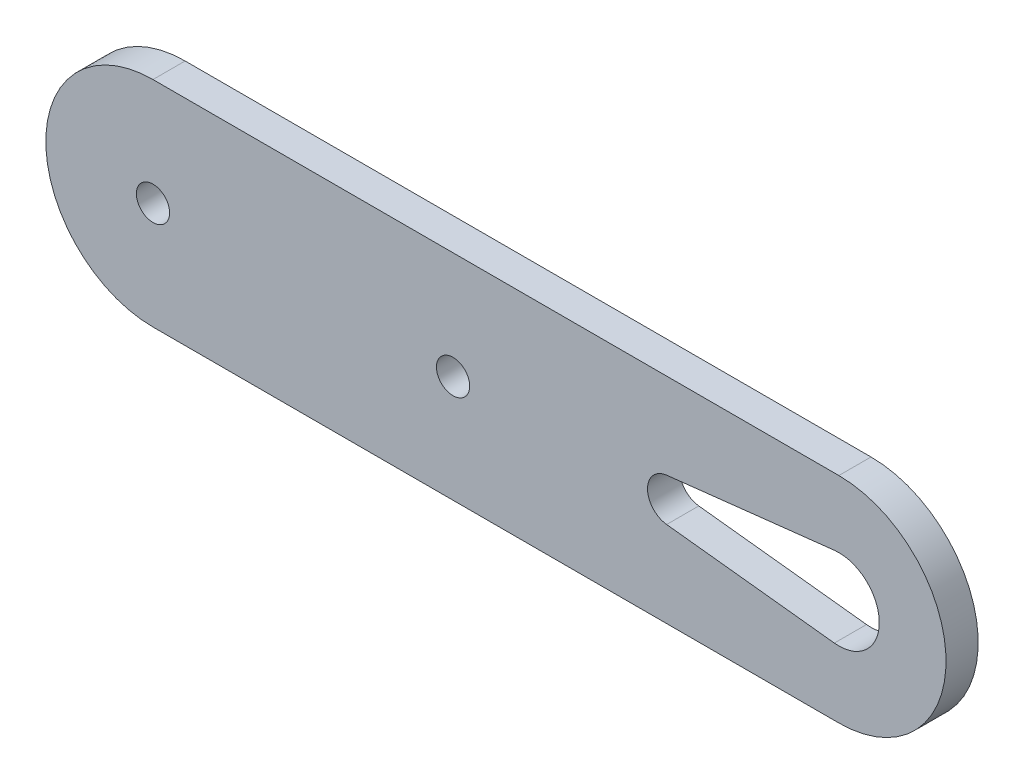
ISO-10303-21;
HEADER;
FILE_DESCRIPTION(('STEP AP214'),'2;1');
FILE_NAME('part.step','',(''),(''),'','','');
FILE_SCHEMA(('AUTOMOTIVE_DESIGN { 1 0 10303 214 1 1 1 1 }'));
ENDSEC;
DATA;
#1=APPLICATION_CONTEXT('core data for automotive mechanical design processes');
#2=APPLICATION_PROTOCOL_DEFINITION('international standard','automotive_design',2000,#1);
#3=PRODUCT_CONTEXT('',#1,'mechanical');
#4=PRODUCT('Part','Part','',(#3));
#5=PRODUCT_RELATED_PRODUCT_CATEGORY('part','',(#4));
#6=PRODUCT_DEFINITION_FORMATION('','',#4);
#7=PRODUCT_DEFINITION_CONTEXT('part definition',#1,'design');
#8=PRODUCT_DEFINITION('design','',#6,#7);
#9=PRODUCT_DEFINITION_SHAPE('','',#8);
#10=(LENGTH_UNIT() NAMED_UNIT(*) SI_UNIT(.MILLI.,.METRE.));
#11=(NAMED_UNIT(*) PLANE_ANGLE_UNIT() SI_UNIT($,.RADIAN.));
#12=(NAMED_UNIT(*) SI_UNIT($,.STERADIAN.) SOLID_ANGLE_UNIT());
#13=UNCERTAINTY_MEASURE_WITH_UNIT(LENGTH_MEASURE(1.E-05),#10,'distance_accuracy_value','');
#14=(GEOMETRIC_REPRESENTATION_CONTEXT(3) GLOBAL_UNCERTAINTY_ASSIGNED_CONTEXT((#13)) GLOBAL_UNIT_ASSIGNED_CONTEXT((#10,
#11,#12)) REPRESENTATION_CONTEXT('',''));
#15=CARTESIAN_POINT('',(0.,0.,0.));
#16=DIRECTION('',(0.,0.,1.));
#17=DIRECTION('',(1.,0.,0.));
#18=AXIS2_PLACEMENT_3D('',#15,#16,#17);
#19=CARTESIAN_POINT('',(-58.0586172408633,14.1910905170263,3.));
#20=DIRECTION('',(0.,0.,-1.));
#21=DIRECTION('',(-1.,0.,0.));
#22=AXIS2_PLACEMENT_3D('',#19,#20,#21);
#23=CYLINDRICAL_SURFACE('',#22,10.);
#24=CARTESIAN_POINT('',(-58.0586172408633,14.1910905170263,0.));
#25=DIRECTION('',(0.,0.,1.));
#26=DIRECTION('',(1.,0.,0.));
#27=AXIS2_PLACEMENT_3D('',#24,#25,#26);
#28=CIRCLE('',#27,10.);
#29=CARTESIAN_POINT('',(-58.0586172408633,24.1910905170263,0.));
#30=VERTEX_POINT('',#29);
#31=CARTESIAN_POINT('',(-58.0586172408633,4.19109051702633,0.));
#32=VERTEX_POINT('',#31);
#33=EDGE_CURVE('E157',#30,#32,#28,.T.);
#34=ORIENTED_EDGE('',*,*,#33,.T.);
#35=DIRECTION('',(0.,0.,-1.));
#36=VECTOR('',#35,1.);
#37=CARTESIAN_POINT('',(-58.0586172408633,4.19109051702633,3.));
#38=LINE('',#37,#36);
#39=CARTESIAN_POINT('',(-58.0586172408633,4.19109051702633,3.));
#40=VERTEX_POINT('',#39);
#41=EDGE_CURVE('E11',#40,#32,#38,.T.);
#42=ORIENTED_EDGE('',*,*,#41,.F.);
#43=CARTESIAN_POINT('',(-58.0586172408633,14.1910905170263,3.));
#44=DIRECTION('',(0.,0.,1.));
#45=DIRECTION('',(1.,0.,0.));
#46=AXIS2_PLACEMENT_3D('',#43,#44,#45);
#47=CIRCLE('',#46,10.);
#48=CARTESIAN_POINT('',(-58.0586172408633,24.1910905170263,3.));
#49=VERTEX_POINT('',#48);
#50=EDGE_CURVE('E163',#49,#40,#47,.T.);
#51=ORIENTED_EDGE('',*,*,#50,.F.);
#52=DIRECTION('',(0.,0.,-1.));
#53=VECTOR('',#52,1.);
#54=CARTESIAN_POINT('',(-58.0586172408633,24.1910905170263,3.));
#55=LINE('',#54,#53);
#56=EDGE_CURVE('E177',#49,#30,#55,.T.);
#57=ORIENTED_EDGE('',*,*,#56,.T.);
#58=EDGE_LOOP('',(#34,#42,#51,#57));
#59=FACE_BOUND('',#58,.T.);
#60=ADVANCED_FACE('F45',(#59),#23,.T.);
#61=CARTESIAN_POINT('',(-58.0586172408633,4.19109051702633,3.));
#62=DIRECTION('',(0.,1.,0.));
#63=DIRECTION('',(0.,0.,1.));
#64=AXIS2_PLACEMENT_3D('',#61,#62,#63);
#65=PLANE('',#64);
#66=DIRECTION('',(1.,0.,0.));
#67=VECTOR('',#66,1.);
#68=CARTESIAN_POINT('',(-58.0586172408633,4.19109051702633,0.));
#69=LINE('',#68,#67);
#70=CARTESIAN_POINT('',(5.94138275913675,4.19109051702633,0.));
#71=VERTEX_POINT('',#70);
#72=EDGE_CURVE('E181',#32,#71,#69,.T.);
#73=ORIENTED_EDGE('',*,*,#72,.T.);
#74=DIRECTION('',(0.,0.,-1.));
#75=VECTOR('',#74,1.);
#76=CARTESIAN_POINT('',(5.94138275913675,4.19109051702633,3.));
#77=LINE('',#76,#75);
#78=CARTESIAN_POINT('',(5.94138275913675,4.19109051702633,3.));
#79=VERTEX_POINT('',#78);
#80=EDGE_CURVE('E53',#79,#71,#77,.T.);
#81=ORIENTED_EDGE('',*,*,#80,.F.);
#82=DIRECTION('',(1.,0.,0.));
#83=VECTOR('',#82,1.);
#84=CARTESIAN_POINT('',(-58.0586172408633,4.19109051702633,3.));
#85=LINE('',#84,#83);
#86=EDGE_CURVE('E167',#40,#79,#85,.T.);
#87=ORIENTED_EDGE('',*,*,#86,.F.);
#88=ORIENTED_EDGE('',*,*,#41,.T.);
#89=EDGE_LOOP('',(#73,#81,#87,#88));
#90=FACE_BOUND('',#89,.T.);
#91=ADVANCED_FACE('F215',(#90),#65,.F.);
#92=CARTESIAN_POINT('',(5.94138275913675,14.1910905170263,3.));
#93=DIRECTION('',(0.,0.,-1.));
#94=DIRECTION('',(-1.,0.,0.));
#95=AXIS2_PLACEMENT_3D('',#92,#93,#94);
#96=CYLINDRICAL_SURFACE('',#95,10.);
#97=CARTESIAN_POINT('',(5.94138275913675,14.1910905170263,0.));
#98=DIRECTION('',(0.,0.,1.));
#99=DIRECTION('',(1.,0.,0.));
#100=AXIS2_PLACEMENT_3D('',#97,#98,#99);
#101=CIRCLE('',#100,10.);
#102=CARTESIAN_POINT('',(5.94138275913675,24.1910905170263,0.));
#103=VERTEX_POINT('',#102);
#104=EDGE_CURVE('E184',#71,#103,#101,.T.);
#105=ORIENTED_EDGE('',*,*,#104,.T.);
#106=DIRECTION('',(0.,0.,-1.));
#107=VECTOR('',#106,1.);
#108=CARTESIAN_POINT('',(5.94138275913675,24.1910905170263,3.));
#109=LINE('',#108,#107);
#110=CARTESIAN_POINT('',(5.94138275913675,24.1910905170263,3.));
#111=VERTEX_POINT('',#110);
#112=EDGE_CURVE('E192',#111,#103,#109,.T.);
#113=ORIENTED_EDGE('',*,*,#112,.F.);
#114=CARTESIAN_POINT('',(5.94138275913675,14.1910905170263,3.));
#115=DIRECTION('',(0.,0.,1.));
#116=DIRECTION('',(1.,0.,0.));
#117=AXIS2_PLACEMENT_3D('',#114,#115,#116);
#118=CIRCLE('',#117,10.);
#119=EDGE_CURVE('E171',#79,#111,#118,.T.);
#120=ORIENTED_EDGE('',*,*,#119,.F.);
#121=ORIENTED_EDGE('',*,*,#80,.T.);
#122=EDGE_LOOP('',(#105,#113,#120,#121));
#123=FACE_BOUND('',#122,.T.);
#124=ADVANCED_FACE('F201',(#123),#96,.T.);
#125=CARTESIAN_POINT('',(-58.0586172408633,24.1910905170263,3.));
#126=DIRECTION('',(0.,-1.,0.));
#127=DIRECTION('',(0.,0.,-1.));
#128=AXIS2_PLACEMENT_3D('',#125,#126,#127);
#129=PLANE('',#128);
#130=DIRECTION('',(-1.,0.,0.));
#131=VECTOR('',#130,1.);
#132=CARTESIAN_POINT('',(-58.0586172408633,24.1910905170263,0.));
#133=LINE('',#132,#131);
#134=EDGE_CURVE('E168',#103,#30,#133,.T.);
#135=ORIENTED_EDGE('',*,*,#134,.T.);
#136=ORIENTED_EDGE('',*,*,#56,.F.);
#137=DIRECTION('',(-1.,0.,0.));
#138=VECTOR('',#137,1.);
#139=CARTESIAN_POINT('',(-58.0586172408633,24.1910905170263,3.));
#140=LINE('',#139,#138);
#141=EDGE_CURVE('E174',#111,#49,#140,.T.);
#142=ORIENTED_EDGE('',*,*,#141,.F.);
#143=ORIENTED_EDGE('',*,*,#112,.T.);
#144=EDGE_LOOP('',(#135,#136,#142,#143));
#145=FACE_BOUND('',#144,.T.);
#146=ADVANCED_FACE('F208',(#145),#129,.F.);
#147=CARTESIAN_POINT('',(-58.0586172408633,14.1910905170263,3.));
#148=DIRECTION('',(0.,0.,1.));
#149=DIRECTION('',(1.,0.,0.));
#150=AXIS2_PLACEMENT_3D('',#147,#148,#149);
#151=PLANE('',#150);
#152=CARTESIAN_POINT('',(-58.0586172408633,14.1910905170263,3.));
#153=DIRECTION('',(0.,0.,-1.));
#154=DIRECTION('',(-1.,0.,0.));
#155=AXIS2_PLACEMENT_3D('',#152,#153,#154);
#156=CIRCLE('',#155,1.55);
#157=CARTESIAN_POINT('',(-59.6086172408633,14.1910905170263,3.));
#158=VERTEX_POINT('',#157);
#159=EDGE_CURVE('E254',#158,#158,#156,.T.);
#160=ORIENTED_EDGE('',*,*,#159,.T.);
#161=EDGE_LOOP('',(#160));
#162=FACE_BOUND('',#161,.T.);
#163=CARTESIAN_POINT('',(-30.0586172408632,14.1910905170263,3.));
#164=DIRECTION('',(0.,0.,1.));
#165=DIRECTION('',(1.,0.,0.));
#166=AXIS2_PLACEMENT_3D('',#163,#164,#165);
#167=CIRCLE('',#166,1.55);
#168=CARTESIAN_POINT('',(-28.5086172408632,14.1910905170263,3.));
#169=VERTEX_POINT('',#168);
#170=EDGE_CURVE('E138',#169,#169,#167,.T.);
#171=ORIENTED_EDGE('',*,*,#170,.F.);
#172=EDGE_LOOP('',(#171));
#173=FACE_BOUND('',#172,.T.);
#174=CARTESIAN_POINT('',(5.94138275913675,14.1910905170263,3.));
#175=DIRECTION('',(0.,0.,1.));
#176=DIRECTION('',(-1.,0.,0.));
#177=AXIS2_PLACEMENT_3D('',#174,#175,#176);
#178=CIRCLE('',#177,3.77357221670818);
#179=CARTESIAN_POINT('',(5.52025656105368,10.4410905170263,3.));
#180=VERTEX_POINT('',#179);
#181=CARTESIAN_POINT('',(5.52025656105367,17.9410905170263,3.));
#182=VERTEX_POINT('',#181);
#183=EDGE_CURVE('E60',#180,#182,#178,.T.);
#184=ORIENTED_EDGE('',*,*,#183,.F.);
#185=DIRECTION('',(0.993753341567491,-0.111598817751109,0.));
#186=VECTOR('',#185,1.);
#187=CARTESIAN_POINT('',(5.52025656105368,10.4410905170263,3.));
#188=LINE('',#187,#186);
#189=CARTESIAN_POINT('',(-10.1297434389463,12.1985905170263,3.));
#190=VERTEX_POINT('',#189);
#191=EDGE_CURVE('E131',#190,#180,#188,.T.);
#192=ORIENTED_EDGE('',*,*,#191,.F.);
#193=CARTESIAN_POINT('',(-9.90598505236485,14.1910905170263,3.));
#194=DIRECTION('',(0.,0.,1.));
#195=DIRECTION('',(1.,0.,0.));
#196=AXIS2_PLACEMENT_3D('',#193,#194,#195);
#197=CIRCLE('',#196,2.00502470447761);
#198=CARTESIAN_POINT('',(-10.1297434389463,16.1835905170263,3.));
#199=VERTEX_POINT('',#198);
#200=EDGE_CURVE('E135',#199,#190,#197,.T.);
#201=ORIENTED_EDGE('',*,*,#200,.F.);
#202=DIRECTION('',(-0.993753341567491,-0.11159881775111,0.));
#203=VECTOR('',#202,1.);
#204=CARTESIAN_POINT('',(5.52025656105369,17.9410905170263,3.));
#205=LINE('',#204,#203);
#206=EDGE_CURVE('E147',#182,#199,#205,.T.);
#207=ORIENTED_EDGE('',*,*,#206,.F.);
#208=EDGE_LOOP('',(#184,#192,#201,#207));
#209=FACE_BOUND('',#208,.T.);
#210=ORIENTED_EDGE('',*,*,#50,.T.);
#211=ORIENTED_EDGE('',*,*,#86,.T.);
#212=ORIENTED_EDGE('',*,*,#119,.T.);
#213=ORIENTED_EDGE('',*,*,#141,.T.);
#214=EDGE_LOOP('',(#210,#211,#212,#213));
#215=FACE_BOUND('',#214,.T.);
#216=ADVANCED_FACE('F214',(#162,#173,#209,#215),#151,.T.);
#217=CARTESIAN_POINT('',(-58.0586172408633,14.1910905170263,0.));
#218=DIRECTION('',(0.,0.,1.));
#219=DIRECTION('',(1.,0.,0.));
#220=AXIS2_PLACEMENT_3D('',#217,#218,#219);
#221=PLANE('',#220);
#222=CARTESIAN_POINT('',(-58.0586172408633,14.1910905170263,0.));
#223=DIRECTION('',(0.,0.,-1.));
#224=DIRECTION('',(-1.,0.,0.));
#225=AXIS2_PLACEMENT_3D('',#222,#223,#224);
#226=CIRCLE('',#225,1.55);
#227=CARTESIAN_POINT('',(-59.6086172408633,14.1910905170263,0.));
#228=VERTEX_POINT('',#227);
#229=EDGE_CURVE('E257',#228,#228,#226,.T.);
#230=ORIENTED_EDGE('',*,*,#229,.F.);
#231=EDGE_LOOP('',(#230));
#232=FACE_BOUND('',#231,.T.);
#233=CARTESIAN_POINT('',(-30.0586172408632,14.1910905170263,0.));
#234=DIRECTION('',(0.,0.,1.));
#235=DIRECTION('',(1.,0.,0.));
#236=AXIS2_PLACEMENT_3D('',#233,#234,#235);
#237=CIRCLE('',#236,1.55);
#238=CARTESIAN_POINT('',(-28.5086172408632,14.1910905170263,0.));
#239=VERTEX_POINT('',#238);
#240=EDGE_CURVE('E148',#239,#239,#237,.T.);
#241=ORIENTED_EDGE('',*,*,#240,.T.);
#242=EDGE_LOOP('',(#241));
#243=FACE_BOUND('',#242,.T.);
#244=DIRECTION('',(0.993753341567491,-0.111598817751109,0.));
#245=VECTOR('',#244,1.);
#246=CARTESIAN_POINT('',(5.52025656105368,10.4410905170263,0.));
#247=LINE('',#246,#245);
#248=CARTESIAN_POINT('',(-10.1297434389463,12.1985905170263,0.));
#249=VERTEX_POINT('',#248);
#250=CARTESIAN_POINT('',(5.52025656105368,10.4410905170263,0.));
#251=VERTEX_POINT('',#250);
#252=EDGE_CURVE('E119',#249,#251,#247,.T.);
#253=ORIENTED_EDGE('',*,*,#252,.T.);
#254=CARTESIAN_POINT('',(5.94138275913675,14.1910905170263,0.));
#255=DIRECTION('',(0.,0.,1.));
#256=DIRECTION('',(-1.,0.,0.));
#257=AXIS2_PLACEMENT_3D('',#254,#255,#256);
#258=CIRCLE('',#257,3.77357221670818);
#259=CARTESIAN_POINT('',(5.52025656105369,17.9410905170263,0.));
#260=VERTEX_POINT('',#259);
#261=EDGE_CURVE('E112',#251,#260,#258,.T.);
#262=ORIENTED_EDGE('',*,*,#261,.T.);
#263=DIRECTION('',(-0.993753341567491,-0.11159881775111,0.));
#264=VECTOR('',#263,1.);
#265=CARTESIAN_POINT('',(5.52025656105369,17.9410905170263,0.));
#266=LINE('',#265,#264);
#267=CARTESIAN_POINT('',(-10.1297434389463,16.1835905170263,0.));
#268=VERTEX_POINT('',#267);
#269=EDGE_CURVE('E122',#260,#268,#266,.T.);
#270=ORIENTED_EDGE('',*,*,#269,.T.);
#271=CARTESIAN_POINT('',(-9.90598505236485,14.1910905170263,0.));
#272=DIRECTION('',(0.,0.,1.));
#273=DIRECTION('',(1.,0.,0.));
#274=AXIS2_PLACEMENT_3D('',#271,#272,#273);
#275=CIRCLE('',#274,2.00502470447761);
#276=EDGE_CURVE('E68',#268,#249,#275,.T.);
#277=ORIENTED_EDGE('',*,*,#276,.T.);
#278=EDGE_LOOP('',(#253,#262,#270,#277));
#279=FACE_BOUND('',#278,.T.);
#280=ORIENTED_EDGE('',*,*,#33,.F.);
#281=ORIENTED_EDGE('',*,*,#134,.F.);
#282=ORIENTED_EDGE('',*,*,#104,.F.);
#283=ORIENTED_EDGE('',*,*,#72,.F.);
#284=EDGE_LOOP('',(#280,#281,#282,#283));
#285=FACE_BOUND('',#284,.T.);
#286=ADVANCED_FACE('F127',(#232,#243,#279,#285),#221,.F.);
#287=CARTESIAN_POINT('',(5.94138275913675,14.1910905170263,0.));
#288=DIRECTION('',(0.,0.,1.));
#289=DIRECTION('',(1.,0.,0.));
#290=AXIS2_PLACEMENT_3D('',#287,#288,#289);
#291=CYLINDRICAL_SURFACE('',#290,3.77357221670818);
#292=ORIENTED_EDGE('',*,*,#183,.T.);
#293=DIRECTION('',(0.,0.,1.));
#294=VECTOR('',#293,1.);
#295=CARTESIAN_POINT('',(5.52025656105369,17.9410905170263,0.));
#296=LINE('',#295,#294);
#297=EDGE_CURVE('E108',#260,#182,#296,.T.);
#298=ORIENTED_EDGE('',*,*,#297,.F.);
#299=ORIENTED_EDGE('',*,*,#261,.F.);
#300=DIRECTION('',(0.,0.,1.));
#301=VECTOR('',#300,1.);
#302=CARTESIAN_POINT('',(5.52025656105368,10.4410905170263,0.));
#303=LINE('',#302,#301);
#304=EDGE_CURVE('E154',#251,#180,#303,.T.);
#305=ORIENTED_EDGE('',*,*,#304,.T.);
#306=EDGE_LOOP('',(#292,#298,#299,#305));
#307=FACE_BOUND('',#306,.T.);
#308=ADVANCED_FACE('F110',(#307),#291,.F.);
#309=CARTESIAN_POINT('',(5.52025656105368,10.4410905170263,0.));
#310=DIRECTION('',(-0.111598817751109,-0.993753341567491,0.));
#311=DIRECTION('',(0.993753341567491,-0.111598817751109,0.));
#312=AXIS2_PLACEMENT_3D('',#309,#310,#311);
#313=PLANE('',#312);
#314=ORIENTED_EDGE('',*,*,#191,.T.);
#315=ORIENTED_EDGE('',*,*,#304,.F.);
#316=ORIENTED_EDGE('',*,*,#252,.F.);
#317=DIRECTION('',(0.,0.,1.));
#318=VECTOR('',#317,1.);
#319=CARTESIAN_POINT('',(-10.1297434389463,12.1985905170263,0.));
#320=LINE('',#319,#318);
#321=EDGE_CURVE('E158',#249,#190,#320,.T.);
#322=ORIENTED_EDGE('',*,*,#321,.T.);
#323=EDGE_LOOP('',(#314,#315,#316,#322));
#324=FACE_BOUND('',#323,.T.);
#325=ADVANCED_FACE('F233',(#324),#313,.F.);
#326=CARTESIAN_POINT('',(-9.90598505236485,14.1910905170263,0.));
#327=DIRECTION('',(0.,0.,1.));
#328=DIRECTION('',(1.,0.,0.));
#329=AXIS2_PLACEMENT_3D('',#326,#327,#328);
#330=CYLINDRICAL_SURFACE('',#329,2.00502470447761);
#331=ORIENTED_EDGE('',*,*,#200,.T.);
#332=ORIENTED_EDGE('',*,*,#321,.F.);
#333=ORIENTED_EDGE('',*,*,#276,.F.);
#334=DIRECTION('',(0.,0.,1.));
#335=VECTOR('',#334,1.);
#336=CARTESIAN_POINT('',(-10.1297434389463,16.1835905170263,0.));
#337=LINE('',#336,#335);
#338=EDGE_CURVE('E118',#268,#199,#337,.T.);
#339=ORIENTED_EDGE('',*,*,#338,.T.);
#340=EDGE_LOOP('',(#331,#332,#333,#339));
#341=FACE_BOUND('',#340,.T.);
#342=ADVANCED_FACE('F237',(#341),#330,.F.);
#343=CARTESIAN_POINT('',(5.52025656105369,17.9410905170263,0.));
#344=DIRECTION('',(-0.111598817751109,0.993753341567491,0.));
#345=DIRECTION('',(-0.993753341567491,-0.111598817751109,0.));
#346=AXIS2_PLACEMENT_3D('',#343,#344,#345);
#347=PLANE('',#346);
#348=ORIENTED_EDGE('',*,*,#206,.T.);
#349=ORIENTED_EDGE('',*,*,#338,.F.);
#350=ORIENTED_EDGE('',*,*,#269,.F.);
#351=ORIENTED_EDGE('',*,*,#297,.T.);
#352=EDGE_LOOP('',(#348,#349,#350,#351));
#353=FACE_BOUND('',#352,.T.);
#354=ADVANCED_FACE('F123',(#353),#347,.F.);
#355=CARTESIAN_POINT('',(-30.0586172408632,14.1910905170263,0.));
#356=DIRECTION('',(0.,0.,1.));
#357=DIRECTION('',(1.,0.,0.));
#358=AXIS2_PLACEMENT_3D('',#355,#356,#357);
#359=CYLINDRICAL_SURFACE('',#358,1.55);
#360=ORIENTED_EDGE('',*,*,#240,.F.);
#361=EDGE_LOOP('',(#360));
#362=FACE_BOUND('',#361,.T.);
#363=ORIENTED_EDGE('',*,*,#170,.T.);
#364=EDGE_LOOP('',(#363));
#365=FACE_BOUND('',#364,.T.);
#366=ADVANCED_FACE('F236',(#362,#365),#359,.F.);
#367=CARTESIAN_POINT('',(-58.0586172408633,14.1910905170263,3.));
#368=DIRECTION('',(0.,0.,-1.));
#369=DIRECTION('',(-1.,0.,0.));
#370=AXIS2_PLACEMENT_3D('',#367,#368,#369);
#371=CYLINDRICAL_SURFACE('',#370,1.55);
#372=ORIENTED_EDGE('',*,*,#159,.F.);
#373=EDGE_LOOP('',(#372));
#374=FACE_BOUND('',#373,.T.);
#375=ORIENTED_EDGE('',*,*,#229,.T.);
#376=EDGE_LOOP('',(#375));
#377=FACE_BOUND('',#376,.T.);
#378=ADVANCED_FACE('F245',(#374,#377),#371,.F.);
#379=CLOSED_SHELL('',(#60,#91,#124,#146,#216,#286,#308,#325,#342,#354,#366,#378));
#380=MANIFOLD_SOLID_BREP('B2',#379);
#381=ADVANCED_BREP_SHAPE_REPRESENTATION('',(#18,#380),#14);
#382=SHAPE_DEFINITION_REPRESENTATION(#9,#381);
ENDSEC;
END-ISO-10303-21;
